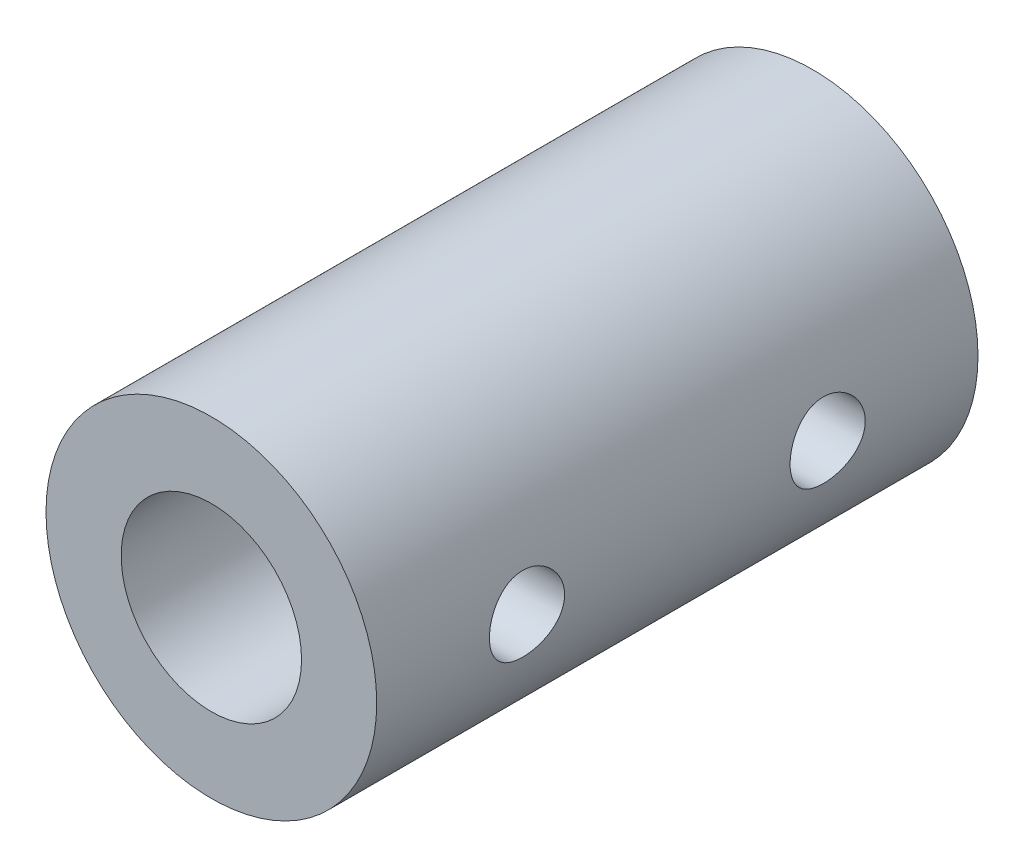
ISO-10303-21;
HEADER;
FILE_DESCRIPTION(('STEP AP214'),'2;1');
FILE_NAME('part.step','',(''),(''),'','','');
FILE_SCHEMA(('AUTOMOTIVE_DESIGN { 1 0 10303 214 1 1 1 1 }'));
ENDSEC;
DATA;
#1=APPLICATION_CONTEXT('core data for automotive mechanical design processes');
#2=APPLICATION_PROTOCOL_DEFINITION('international standard','automotive_design',2000,#1);
#3=PRODUCT_CONTEXT('',#1,'mechanical');
#4=PRODUCT('Part','Part','',(#3));
#5=PRODUCT_RELATED_PRODUCT_CATEGORY('part','',(#4));
#6=PRODUCT_DEFINITION_FORMATION('','',#4);
#7=PRODUCT_DEFINITION_CONTEXT('part definition',#1,'design');
#8=PRODUCT_DEFINITION('design','',#6,#7);
#9=PRODUCT_DEFINITION_SHAPE('','',#8);
#10=(LENGTH_UNIT() NAMED_UNIT(*) SI_UNIT(.MILLI.,.METRE.));
#11=(NAMED_UNIT(*) PLANE_ANGLE_UNIT() SI_UNIT($,.RADIAN.));
#12=(NAMED_UNIT(*) SI_UNIT($,.STERADIAN.) SOLID_ANGLE_UNIT());
#13=UNCERTAINTY_MEASURE_WITH_UNIT(LENGTH_MEASURE(1.E-05),#10,'distance_accuracy_value','');
#14=(GEOMETRIC_REPRESENTATION_CONTEXT(3) GLOBAL_UNCERTAINTY_ASSIGNED_CONTEXT((#13)) GLOBAL_UNIT_ASSIGNED_CONTEXT((#10,
#11,#12)) REPRESENTATION_CONTEXT('',''));
#15=CARTESIAN_POINT('',(0.,0.,0.));
#16=DIRECTION('',(0.,0.,1.));
#17=DIRECTION('',(1.,0.,0.));
#18=AXIS2_PLACEMENT_3D('',#15,#16,#17);
#19=CARTESIAN_POINT('',(0.,0.,20.));
#20=DIRECTION('',(0.,0.,1.));
#21=DIRECTION('',(1.,0.,0.));
#22=AXIS2_PLACEMENT_3D('',#19,#20,#21);
#23=PLANE('',#22);
#24=CARTESIAN_POINT('',(0.,0.,20.));
#25=DIRECTION('',(0.,0.,1.));
#26=DIRECTION('',(1.,0.,0.));
#27=AXIS2_PLACEMENT_3D('',#24,#25,#26);
#28=CIRCLE('',#27,5.5);
#29=CARTESIAN_POINT('',(5.5,0.,20.));
#30=VERTEX_POINT('',#29);
#31=EDGE_CURVE('E58',#30,#30,#28,.T.);
#32=ORIENTED_EDGE('',*,*,#31,.T.);
#33=EDGE_LOOP('',(#32));
#34=FACE_BOUND('',#33,.T.);
#35=CARTESIAN_POINT('',(0.,0.,20.));
#36=DIRECTION('',(0.,0.,1.));
#37=DIRECTION('',(1.,0.,0.));
#38=AXIS2_PLACEMENT_3D('',#35,#36,#37);
#39=CIRCLE('',#38,3.);
#40=CARTESIAN_POINT('',(3.,0.,20.));
#41=VERTEX_POINT('',#40);
#42=EDGE_CURVE('E94',#41,#41,#39,.T.);
#43=ORIENTED_EDGE('',*,*,#42,.F.);
#44=EDGE_LOOP('',(#43));
#45=FACE_BOUND('',#44,.T.);
#46=ADVANCED_FACE('F43',(#34,#45),#23,.T.);
#47=CARTESIAN_POINT('',(0.,0.,0.));
#48=DIRECTION('',(0.,0.,1.));
#49=DIRECTION('',(1.,0.,0.));
#50=AXIS2_PLACEMENT_3D('',#47,#48,#49);
#51=PLANE('',#50);
#52=CARTESIAN_POINT('',(0.,0.,0.));
#53=DIRECTION('',(0.,0.,1.));
#54=DIRECTION('',(1.,0.,0.));
#55=AXIS2_PLACEMENT_3D('',#52,#53,#54);
#56=CIRCLE('',#55,5.5);
#57=CARTESIAN_POINT('',(5.5,0.,0.));
#58=VERTEX_POINT('',#57);
#59=EDGE_CURVE('E63',#58,#58,#56,.T.);
#60=ORIENTED_EDGE('',*,*,#59,.F.);
#61=EDGE_LOOP('',(#60));
#62=FACE_BOUND('',#61,.T.);
#63=CARTESIAN_POINT('',(0.,0.,0.));
#64=DIRECTION('',(0.,0.,1.));
#65=DIRECTION('',(1.,0.,0.));
#66=AXIS2_PLACEMENT_3D('',#63,#64,#65);
#67=CIRCLE('',#66,3.);
#68=CARTESIAN_POINT('',(3.,0.,0.));
#69=VERTEX_POINT('',#68);
#70=EDGE_CURVE('E89',#69,#69,#67,.T.);
#71=ORIENTED_EDGE('',*,*,#70,.T.);
#72=EDGE_LOOP('',(#71));
#73=FACE_BOUND('',#72,.T.);
#74=ADVANCED_FACE('F102',(#62,#73),#51,.F.);
#75=CARTESIAN_POINT('',(0.,0.,20.));
#76=DIRECTION('',(0.,0.,-1.));
#77=DIRECTION('',(-1.,0.,0.));
#78=AXIS2_PLACEMENT_3D('',#75,#76,#77);
#79=CYLINDRICAL_SURFACE('',#78,5.5);
#80=CARTESIAN_POINT('',(5.5,0.,16.25));
#81=CARTESIAN_POINT('',(5.49999873675926,0.0692591392984521,16.2499977340868));
#82=CARTESIAN_POINT('',(5.49867854673065,0.138545086129004,16.2442243862115));
#83=CARTESIAN_POINT('',(5.493539660153,0.275144297299661,16.2213102619692));
#84=CARTESIAN_POINT('',(5.48971927481324,0.342456196110364,16.2041618020224));
#85=CARTESIAN_POINT('',(5.48000476561469,0.473113835992457,16.1590659756841));
#86=CARTESIAN_POINT('',(5.47411289428369,0.536463797478236,16.1311303360096));
#87=CARTESIAN_POINT('',(5.46088910081351,0.657576137912829,16.0652914433096));
#88=CARTESIAN_POINT('',(5.45355719301993,0.715338572515909,16.0273882895788));
#89=CARTESIAN_POINT('',(5.4381132908407,0.824633802223188,15.9419989776967));
#90=CARTESIAN_POINT('',(5.42999098791628,0.876056469460243,15.8943737132625));
#91=CARTESIAN_POINT('',(5.41395325591652,0.97025694908305,15.7911905129314));
#92=CARTESIAN_POINT('',(5.40603784654665,1.01303394060892,15.7356318246528));
#93=CARTESIAN_POINT('',(5.39120791846105,1.08922299700893,15.6173339723582));
#94=CARTESIAN_POINT('',(5.38430657902887,1.12251627178287,15.5545165018471));
#95=CARTESIAN_POINT('',(5.37243480737543,1.17803034858935,15.4239952497092));
#96=CARTESIAN_POINT('',(5.36746412440839,1.20025258858874,15.3562921039692));
#97=CARTESIAN_POINT('',(5.36012172349153,1.23262674706359,15.2191204064417));
#98=CARTESIAN_POINT('',(5.3577078986695,1.24297446340377,15.1497003684387));
#99=CARTESIAN_POINT('',(5.35562617033839,1.25191494225743,15.0100708863934));
#100=CARTESIAN_POINT('',(5.35595790132902,1.25050926943276,14.9398615486689));
#101=CARTESIAN_POINT('',(5.35929175179597,1.23614008479381,14.8021135583257));
#102=CARTESIAN_POINT('',(5.36224097064878,1.22340552299718,14.7345495469025));
#103=CARTESIAN_POINT('',(5.37039368363716,1.18710342460251,14.6025427569226));
#104=CARTESIAN_POINT('',(5.3755973132372,1.16353523702144,14.5381001661864));
#105=CARTESIAN_POINT('',(5.38772371922684,1.10602867201272,14.4135296640947));
#106=CARTESIAN_POINT('',(5.39466077989125,1.07200356043003,14.3534432411182));
#107=CARTESIAN_POINT('',(5.40946384216207,0.994609889602035,14.2397487234445));
#108=CARTESIAN_POINT('',(5.41732997981731,0.951239961185668,14.186141579868));
#109=CARTESIAN_POINT('',(5.43333076436253,0.85518259001758,14.0856107190895));
#110=CARTESIAN_POINT('',(5.44146738675749,0.802300833714135,14.0388727867418));
#111=CARTESIAN_POINT('',(5.45692512985791,0.68935614920486,13.9548970556464));
#112=CARTESIAN_POINT('',(5.46424623341466,0.629293070045399,13.9176594566503));
#113=CARTESIAN_POINT('',(5.47727487123187,0.503453995899576,13.8536898060143));
#114=CARTESIAN_POINT('',(5.48297842424367,0.437664417174078,13.8269836131888));
#115=CARTESIAN_POINT('',(5.49209994783491,0.302372561245848,13.785057997066));
#116=CARTESIAN_POINT('',(5.4955182778892,0.23287086983186,13.7698367670889));
#117=CARTESIAN_POINT('',(5.4996325035878,0.0937199200963662,13.7515868812637));
#118=CARTESIAN_POINT('',(5.50038500920564,0.0241055461685193,13.7483046543416));
#119=CARTESIAN_POINT('',(5.49924211275316,-0.114676943340051,13.7533365199265));
#120=CARTESIAN_POINT('',(5.49734690539558,-0.183845091360428,13.761649759703));
#121=CARTESIAN_POINT('',(5.49115740518707,-0.318920838609229,13.7894265834527));
#122=CARTESIAN_POINT('',(5.4868920435275,-0.384857518407212,13.8087557732219));
#123=CARTESIAN_POINT('',(5.47644030661836,-0.512551965438801,13.8578655137285));
#124=CARTESIAN_POINT('',(5.47025375902772,-0.574309357161442,13.8876470021266));
#125=CARTESIAN_POINT('',(5.45650716375474,-0.692930426280277,13.9573345717777));
#126=CARTESIAN_POINT('',(5.4489276492766,-0.749705342613595,13.9973878133866));
#127=CARTESIAN_POINT('',(5.43327304782299,-0.855818867895258,14.0862896642201));
#128=CARTESIAN_POINT('',(5.42519789109562,-0.905156426789845,14.1351395132734));
#129=CARTESIAN_POINT('',(5.40926438572433,-0.996008531090476,14.2414154825667));
#130=CARTESIAN_POINT('',(5.40141360596267,-1.03734683297031,14.2989936208934));
#131=CARTESIAN_POINT('',(5.3870011660802,-1.10976907203276,14.4204231953351));
#132=CARTESIAN_POINT('',(5.38043944897962,-1.14085346250508,14.4842743539798));
#133=CARTESIAN_POINT('',(5.36941374353368,-1.19166798620964,14.6160902347845));
#134=CARTESIAN_POINT('',(5.3649376890851,-1.21146358110852,14.6840286618717));
#135=CARTESIAN_POINT('',(5.35857055292907,-1.23932629170182,14.8223834533496));
#136=CARTESIAN_POINT('',(5.35667901955397,-1.24739545670807,14.8927993825682));
#137=CARTESIAN_POINT('',(5.35572514716112,-1.25148369607082,15.0323293096554));
#138=CARTESIAN_POINT('',(5.35659707290885,-1.24778274250535,15.1014347996668));
#139=CARTESIAN_POINT('',(5.36092234234569,-1.22906557701641,15.2380094550941));
#140=CARTESIAN_POINT('',(5.36437565044739,-1.21404952108504,15.3054786430552));
#141=CARTESIAN_POINT('',(5.37344130135242,-1.17326846180304,15.4366216986831));
#142=CARTESIAN_POINT('',(5.37904483343351,-1.14754728763997,15.5003098455707));
#143=CARTESIAN_POINT('',(5.39178236164052,-1.0861226830344,15.6225073534503));
#144=CARTESIAN_POINT('',(5.39891653159829,-1.05041811865611,15.6810161251628));
#145=CARTESIAN_POINT('',(5.41410553631702,-0.969124984455244,15.7925672138276));
#146=CARTESIAN_POINT('',(5.42217702793932,-0.923338228214169,15.8454628611037));
#147=CARTESIAN_POINT('',(5.43822274296525,-0.823578144662087,15.942911592541));
#148=CARTESIAN_POINT('',(5.44619694333323,-0.769602917703378,15.987462735483));
#149=CARTESIAN_POINT('',(5.46128466945207,-0.654070302575283,16.0675690301169));
#150=CARTESIAN_POINT('',(5.46838430808557,-0.5924158109381,16.1029869116666));
#151=CARTESIAN_POINT('',(5.48078202756997,-0.463877983855845,16.1628999853315));
#152=CARTESIAN_POINT('',(5.48608156233362,-0.396998922168847,16.1874039973933));
#153=CARTESIAN_POINT('',(5.49337797563919,-0.27508153576981,16.2206139530881));
#154=CARTESIAN_POINT('',(5.49584542792493,-0.220684055569244,16.2316119938446));
#155=CARTESIAN_POINT('',(5.49915690403688,-0.110863407465458,16.2463057367897));
#156=CARTESIAN_POINT('',(5.50000101119414,-0.0554402923585502,16.2500018138096));
#157=CARTESIAN_POINT('',(5.5,0.,16.25));
#158=B_SPLINE_CURVE_WITH_KNOTS('',3,(#80,#81,#82,#83,#84,#85,#86,#87,#88,#89,#90,#91,#92,#93,
#94,#95,#96,#97,#98,#99,#100,#101,#102,#103,#104,#105,#106,#107,#108,#109,#110,#111,#112,#113,
#114,#115,#116,#117,#118,#119,#120,#121,#122,#123,#124,#125,#126,#127,#128,#129,#130,#131,#132,
#133,#134,#135,#136,#137,#138,#139,#140,#141,#142,#143,#144,#145,#146,#147,#148,#149,#150,#151,
#152,#153,#154,#155,#156,#157),.UNSPECIFIED.,.T.,.F.,(4,2,2,2,2,2,2,2,2,2,2,2,2,2,2,2,2,2,2,2,2,
2,2,2,2,2,2,2,2,2,2,2,2,2,2,2,2,2,4),(0.,0.207574424816657,0.415289203498463,0.622778808776593,
0.830266347152624,1.04096194698404,1.25167754182901,1.46492681486707,1.67814838269119,
1.88780122449041,2.09742615684378,2.30290857087117,2.50840333376985,2.71565078719425,
2.92292862648988,3.13505765901851,3.3471911513493,3.55984232048323,3.77246003084947,
3.9805347095838,4.18859408731812,4.39416788074517,4.5997601206154,4.80848064664382,
5.01723061362836,5.23015660770196,5.44307318779737,5.65474220954493,5.86637423554698,
6.07301021975725,6.27964335529766,6.48543868288071,6.69125739465899,6.90155512892952,
7.11190172510031,7.32524638726731,7.53841832261075,7.70458523862177,7.87074362456999),.UNSPECIFIED.);
#159=CARTESIAN_POINT('',(5.5,0.,16.25));
#160=VERTEX_POINT('',#159);
#161=EDGE_CURVE('E90',#160,#160,#158,.T.);
#162=ORIENTED_EDGE('',*,*,#161,.T.);
#163=EDGE_LOOP('',(#162));
#164=FACE_BOUND('',#163,.T.);
#165=CARTESIAN_POINT('',(5.5,0.,6.25));
#166=CARTESIAN_POINT('',(5.49999873675926,0.0692591392984519,6.24999773408679));
#167=CARTESIAN_POINT('',(5.49867854673065,0.138545086129004,6.24422438621155));
#168=CARTESIAN_POINT('',(5.493539660153,0.275144297299661,6.22131026196915));
#169=CARTESIAN_POINT('',(5.48971927481324,0.342456196110364,6.20416180202237));
#170=CARTESIAN_POINT('',(5.48000476561469,0.473113835992457,6.15906597568405));
#171=CARTESIAN_POINT('',(5.4741128942837,0.536463797478235,6.13113033600963));
#172=CARTESIAN_POINT('',(5.46088910081351,0.657576137912828,6.06529144330956));
#173=CARTESIAN_POINT('',(5.45355719301993,0.715338572515908,6.02738828957879));
#174=CARTESIAN_POINT('',(5.4381132908407,0.824633802223187,5.94199897769666));
#175=CARTESIAN_POINT('',(5.42999098791629,0.876056469460242,5.8943737132625));
#176=CARTESIAN_POINT('',(5.41395325591652,0.970256949083049,5.79119051293138));
#177=CARTESIAN_POINT('',(5.40603784654665,1.01303394060892,5.73563182465277));
#178=CARTESIAN_POINT('',(5.39120791846105,1.08922299700893,5.61733397235816));
#179=CARTESIAN_POINT('',(5.38430657902887,1.12251627178287,5.55451650184708));
#180=CARTESIAN_POINT('',(5.37243480737543,1.17803034858935,5.42399524970919));
#181=CARTESIAN_POINT('',(5.36746412440839,1.20025258858874,5.35629210396919));
#182=CARTESIAN_POINT('',(5.36012172349153,1.23262674706359,5.21912040644173));
#183=CARTESIAN_POINT('',(5.3577078986695,1.24297446340377,5.14970036843873));
#184=CARTESIAN_POINT('',(5.35562617033839,1.25191494225743,5.01007088639345));
#185=CARTESIAN_POINT('',(5.35595790132901,1.25050926943276,4.93986154866886));
#186=CARTESIAN_POINT('',(5.35929175179597,1.23614008479381,4.80211355832565));
#187=CARTESIAN_POINT('',(5.36224097064878,1.22340552299719,4.73454954690255));
#188=CARTESIAN_POINT('',(5.37039368363716,1.18710342460251,4.60254275692259));
#189=CARTESIAN_POINT('',(5.3755973132372,1.16353523702144,4.53810016618641));
#190=CARTESIAN_POINT('',(5.38772371922684,1.10602867201272,4.41352966409474));
#191=CARTESIAN_POINT('',(5.39466077989125,1.07200356043004,4.35344324111816));
#192=CARTESIAN_POINT('',(5.40946384216207,0.994609889602037,4.23974872344447));
#193=CARTESIAN_POINT('',(5.41732997981731,0.951239961185669,4.18614157986804));
#194=CARTESIAN_POINT('',(5.43333076436253,0.855182590017581,4.08561071908949));
#195=CARTESIAN_POINT('',(5.44146738675749,0.802300833714136,4.03887278674183));
#196=CARTESIAN_POINT('',(5.45692512985791,0.689356149204861,3.95489705564645));
#197=CARTESIAN_POINT('',(5.46424623341466,0.6292930700454,3.91765945665027));
#198=CARTESIAN_POINT('',(5.47727487123187,0.503453995899577,3.85368980601425));
#199=CARTESIAN_POINT('',(5.48297842424367,0.437664417174079,3.82698361318884));
#200=CARTESIAN_POINT('',(5.49209994783491,0.302372561245849,3.78505799706604));
#201=CARTESIAN_POINT('',(5.4955182778892,0.23287086983186,3.76983676708891));
#202=CARTESIAN_POINT('',(5.4996325035878,0.0937199200963669,3.75158688126366));
#203=CARTESIAN_POINT('',(5.50038500920564,0.0241055461685197,3.74830465434164));
#204=CARTESIAN_POINT('',(5.49924211275316,-0.114676943340051,3.75333651992647));
#205=CARTESIAN_POINT('',(5.49734690539558,-0.183845091360428,3.76164975970299));
#206=CARTESIAN_POINT('',(5.49115740518707,-0.318920838609228,3.78942658345271));
#207=CARTESIAN_POINT('',(5.4868920435275,-0.384857518407211,3.80875577322187));
#208=CARTESIAN_POINT('',(5.47644030661836,-0.5125519654388,3.85786551372854));
#209=CARTESIAN_POINT('',(5.47025375902772,-0.574309357161442,3.88764700212663));
#210=CARTESIAN_POINT('',(5.45650716375474,-0.692930426280277,3.95733457177767));
#211=CARTESIAN_POINT('',(5.4489276492766,-0.749705342613595,3.99738781338658));
#212=CARTESIAN_POINT('',(5.43327304782299,-0.855818867895258,4.0862896642201));
#213=CARTESIAN_POINT('',(5.42519789109562,-0.905156426789845,4.13513951327342));
#214=CARTESIAN_POINT('',(5.40926438572433,-0.996008531090475,4.24141548256671));
#215=CARTESIAN_POINT('',(5.40141360596267,-1.03734683297031,4.29899362089341));
#216=CARTESIAN_POINT('',(5.3870011660802,-1.10976907203276,4.42042319533514));
#217=CARTESIAN_POINT('',(5.38043944897962,-1.14085346250508,4.48427435397981));
#218=CARTESIAN_POINT('',(5.36941374353368,-1.19166798620963,4.61609023478446));
#219=CARTESIAN_POINT('',(5.3649376890851,-1.21146358110852,4.68402866187168));
#220=CARTESIAN_POINT('',(5.35857055292907,-1.23932629170182,4.82238345334956));
#221=CARTESIAN_POINT('',(5.35667901955397,-1.24739545670807,4.8927993825682));
#222=CARTESIAN_POINT('',(5.35572514716112,-1.25148369607082,5.03232930965545));
#223=CARTESIAN_POINT('',(5.35659707290885,-1.24778274250535,5.1014347996668));
#224=CARTESIAN_POINT('',(5.36092234234569,-1.22906557701641,5.23800945509413));
#225=CARTESIAN_POINT('',(5.36437565044739,-1.21404952108504,5.30547864305523));
#226=CARTESIAN_POINT('',(5.37344130135242,-1.17326846180304,5.43662169868314));
#227=CARTESIAN_POINT('',(5.37904483343351,-1.14754728763997,5.50030984557075));
#228=CARTESIAN_POINT('',(5.39178236164052,-1.0861226830344,5.6225073534503));
#229=CARTESIAN_POINT('',(5.39891653159829,-1.05041811865611,5.68101612516275));
#230=CARTESIAN_POINT('',(5.41410553631702,-0.969124984455243,5.79256721382764));
#231=CARTESIAN_POINT('',(5.42217702793932,-0.923338228214167,5.84546286110369));
#232=CARTESIAN_POINT('',(5.43822274296525,-0.823578144662084,5.94291159254098));
#233=CARTESIAN_POINT('',(5.44619694333323,-0.769602917703375,5.98746273548298));
#234=CARTESIAN_POINT('',(5.46128466945207,-0.65407030257528,6.06756903011686));
#235=CARTESIAN_POINT('',(5.46838430808557,-0.592415810938097,6.10298691166657));
#236=CARTESIAN_POINT('',(5.48078202756997,-0.463877983855843,6.16289998533147));
#237=CARTESIAN_POINT('',(5.48608156233362,-0.396998922168846,6.18740399739333));
#238=CARTESIAN_POINT('',(5.49337797563919,-0.27508153576981,6.22061395308806));
#239=CARTESIAN_POINT('',(5.49584542792493,-0.220684055569243,6.23161199384465));
#240=CARTESIAN_POINT('',(5.49915690403688,-0.110863407465457,6.24630573678967));
#241=CARTESIAN_POINT('',(5.50000101119414,-0.05544029235855,6.25000181380958));
#242=CARTESIAN_POINT('',(5.5,0.,6.25));
#243=B_SPLINE_CURVE_WITH_KNOTS('',3,(#165,#166,#167,#168,#169,#170,#171,#172,#173,#174,#175,
#176,#177,#178,#179,#180,#181,#182,#183,#184,#185,#186,#187,#188,#189,#190,#191,#192,#193,#194,
#195,#196,#197,#198,#199,#200,#201,#202,#203,#204,#205,#206,#207,#208,#209,#210,#211,#212,#213,
#214,#215,#216,#217,#218,#219,#220,#221,#222,#223,#224,#225,#226,#227,#228,#229,#230,#231,#232,
#233,#234,#235,#236,#237,#238,#239,#240,#241,#242),.UNSPECIFIED.,.T.,.F.,(4,2,2,2,2,2,2,2,2,2,2,
2,2,2,2,2,2,2,2,2,2,2,2,2,2,2,2,2,2,2,2,2,2,2,2,2,2,2,4),(0.,0.207574424816657,
0.415289203498463,0.622778808776591,0.830266347152622,1.04096194698404,1.25167754182901,
1.46492681486707,1.67814838269119,1.8878012244904,2.09742615684378,2.30290857087117,
2.50840333376985,2.71565078719424,2.92292862648988,3.13505765901851,3.3471911513493,
3.55984232048323,3.77246003084946,3.9805347095838,4.18859408731812,4.39416788074517,
4.5997601206154,4.80848064664382,5.01723061362836,5.23015660770196,5.44307318779737,
5.65474220954493,5.86637423554697,6.07301021975725,6.27964335529766,6.48543868288071,
6.69125739465899,6.90155512892953,7.11190172510032,7.32524638726731,7.53841832261075,
7.70458523862177,7.87074362456999),.UNSPECIFIED.);
#244=CARTESIAN_POINT('',(5.5,0.,6.25));
#245=VERTEX_POINT('',#244);
#246=EDGE_CURVE('E10',#245,#245,#243,.T.);
#247=ORIENTED_EDGE('',*,*,#246,.T.);
#248=EDGE_LOOP('',(#247));
#249=FACE_BOUND('',#248,.T.);
#250=ORIENTED_EDGE('',*,*,#31,.F.);
#251=EDGE_LOOP('',(#250));
#252=FACE_BOUND('',#251,.T.);
#253=ORIENTED_EDGE('',*,*,#59,.T.);
#254=EDGE_LOOP('',(#253));
#255=FACE_BOUND('',#254,.T.);
#256=ADVANCED_FACE('F45',(#164,#249,#252,#255),#79,.T.);
#257=CARTESIAN_POINT('',(0.,0.,20.));
#258=DIRECTION('',(0.,0.,-1.));
#259=DIRECTION('',(-1.,0.,0.));
#260=AXIS2_PLACEMENT_3D('',#257,#258,#259);
#261=CYLINDRICAL_SURFACE('',#260,3.);
#262=CARTESIAN_POINT('',(3.,0.,16.25));
#263=CARTESIAN_POINT('',(2.99999458367273,0.0669580526362668,16.2499927949087));
#264=CARTESIAN_POINT('',(2.9977323297471,0.134021397063841,16.2445880414719));
#265=CARTESIAN_POINT('',(2.98890153579552,0.266247371156347,16.2231609350798));
#266=CARTESIAN_POINT('',(2.98232175901028,0.331404576423564,16.2071108755357));
#267=CARTESIAN_POINT('',(2.96556289038127,0.457688733653087,16.1650889082194));
#268=CARTESIAN_POINT('',(2.95539599975004,0.518828524426268,16.1391506105318));
#269=CARTESIAN_POINT('',(2.93245286470664,0.635829756679801,16.0782271767674));
#270=CARTESIAN_POINT('',(2.91967741092849,0.691692790015938,16.0432447810291));
#271=CARTESIAN_POINT('',(2.89207828351869,0.79944840355951,15.9633710174091));
#272=CARTESIAN_POINT('',(2.87718753326093,0.851041267517766,15.9180986912102));
#273=CARTESIAN_POINT('',(2.84732714068514,0.94615982109126,15.8197356652174));
#274=CARTESIAN_POINT('',(2.83235746106809,0.989681263153084,15.7666408751055));
#275=CARTESIAN_POINT('',(2.80321021812995,1.06953737697065,15.6509732224351));
#276=CARTESIAN_POINT('',(2.78910786873385,1.10541308153925,15.5880625515735));
#277=CARTESIAN_POINT('',(2.76435572357005,1.16593940588865,15.4564267420791));
#278=CARTESIAN_POINT('',(2.75370415000824,1.19059580836291,15.3877046205155));
#279=CARTESIAN_POINT('',(2.73778555387705,1.22674598312159,15.2498463082321));
#280=CARTESIAN_POINT('',(2.73228387651787,1.23881657877605,15.1808895166078));
#281=CARTESIAN_POINT('',(2.72661326219504,1.25125209967796,15.0417267073134));
#282=CARTESIAN_POINT('',(2.7264413842526,1.25162348054397,14.9715213999743));
#283=CARTESIAN_POINT('',(2.73125119560853,1.24108450363674,14.8375999395651));
#284=CARTESIAN_POINT('',(2.73583882723623,1.23103681112301,14.7737989034355));
#285=CARTESIAN_POINT('',(2.74898482773796,1.20139191015776,14.6488879089996));
#286=CARTESIAN_POINT('',(2.75754395703564,1.18179287287177,14.5877784685082));
#287=CARTESIAN_POINT('',(2.77786184772757,1.13321958727571,14.4684422970086));
#288=CARTESIAN_POINT('',(2.78968481949136,1.10405471539236,14.4103045790866));
#289=CARTESIAN_POINT('',(2.81518331141086,1.03731242580562,14.2995222661199));
#290=CARTESIAN_POINT('',(2.8288595612978,0.999731690519542,14.2468798493865));
#291=CARTESIAN_POINT('',(2.85792976877979,0.913495965543833,14.1439000412672));
#292=CARTESIAN_POINT('',(2.87337121404473,0.864173483207525,14.0941334326146));
#293=CARTESIAN_POINT('',(2.90325673112529,0.757729591051512,14.0033864970408));
#294=CARTESIAN_POINT('',(2.9177005687701,0.700606359448456,13.9624082283078));
#295=CARTESIAN_POINT('',(2.94438283556473,0.578447948693376,13.8895641763837));
#296=CARTESIAN_POINT('',(2.95656266543334,0.51326058244768,13.8579305548493));
#297=CARTESIAN_POINT('',(2.97689481414803,0.377852402526831,13.8062788603967));
#298=CARTESIAN_POINT('',(2.985049358458,0.307634394795034,13.7862543680562));
#299=CARTESIAN_POINT('',(2.99599641186385,0.168928113346227,13.7595840078734));
#300=CARTESIAN_POINT('',(2.99909541047125,0.100611285278639,13.7521721425563));
#301=CARTESIAN_POINT('',(3.00056050368745,-0.0363546554960887,13.7486537763859));
#302=CARTESIAN_POINT('',(2.99892795711939,-0.105003667152635,13.752544029748));
#303=CARTESIAN_POINT('',(2.9913121765694,-0.237098242341435,13.7709710848061));
#304=CARTESIAN_POINT('',(2.9855488728399,-0.300632966639386,13.7849699540972));
#305=CARTESIAN_POINT('',(2.97048606772414,-0.42438274897109,13.8224681945408));
#306=CARTESIAN_POINT('',(2.96118611959704,-0.48459738651836,13.8459687659503));
#307=CARTESIAN_POINT('',(2.93958270645166,-0.602108999869135,13.9025709757121));
#308=CARTESIAN_POINT('',(2.92719491469281,-0.659257236855323,13.935948183146));
#309=CARTESIAN_POINT('',(2.9007380457909,-0.767346216231428,14.0110533777917));
#310=CARTESIAN_POINT('',(2.88666826768733,-0.81828435260194,14.0527848515293));
#311=CARTESIAN_POINT('',(2.85712087895438,-0.916333430274262,14.1469032332724));
#312=CARTESIAN_POINT('',(2.84161451591029,-0.962910697979834,14.1998385029863));
#313=CARTESIAN_POINT('',(2.81184336768005,-1.04666984610551,14.3130212759354));
#314=CARTESIAN_POINT('',(2.79757886493439,-1.08384959285617,14.3732704351717));
#315=CARTESIAN_POINT('',(2.77181386243988,-1.14815960208699,14.5006141753026));
#316=CARTESIAN_POINT('',(2.76035562555112,-1.17513918237329,14.5677940355148));
#317=CARTESIAN_POINT('',(2.74208355658957,-1.21717413951573,14.7063705938101));
#318=CARTESIAN_POINT('',(2.73526589555752,-1.23223934863687,14.7777637624833));
#319=CARTESIAN_POINT('',(2.72763164537264,-1.249040803489,14.9168186991992));
#320=CARTESIAN_POINT('',(2.72639350967163,-1.25171380413129,14.9843446622926));
#321=CARTESIAN_POINT('',(2.72893853011024,-1.24615575523912,15.1188428611411));
#322=CARTESIAN_POINT('',(2.73272091540307,-1.23792637964721,15.1858151803137));
#323=CARTESIAN_POINT('',(2.74449551302268,-1.21158404780491,15.3140927474689));
#324=CARTESIAN_POINT('',(2.7522835484648,-1.19394903571466,15.3755166734634));
#325=CARTESIAN_POINT('',(2.77103181199189,-1.14976328202134,15.4945480213572));
#326=CARTESIAN_POINT('',(2.78199293131693,-1.12321003517252,15.5521543653988));
#327=CARTESIAN_POINT('',(2.80666954560013,-1.06010285935489,15.6656958959491));
#328=CARTESIAN_POINT('',(2.82051102713679,-1.02304360910483,15.7213223301683));
#329=CARTESIAN_POINT('',(2.84903689053839,-0.94068407263039,15.8258601393607));
#330=CARTESIAN_POINT('',(2.86372156345875,-0.895380928905618,15.8747691756006));
#331=CARTESIAN_POINT('',(2.89356392850106,-0.793902045778819,15.9681486816847));
#332=CARTESIAN_POINT('',(2.90867817511792,-0.737174739949026,16.0120364328406));
#333=CARTESIAN_POINT('',(2.9366014362202,-0.616600079253197,16.0896994535436));
#334=CARTESIAN_POINT('',(2.9494093991674,-0.552749497945744,16.1234701148895));
#335=CARTESIAN_POINT('',(2.97109183362461,-0.42073205671795,16.1792098454399));
#336=CARTESIAN_POINT('',(2.98002782581964,-0.352653990980635,16.2013647666173));
#337=CARTESIAN_POINT('',(2.99321009768625,-0.213410421846558,16.2337063290778));
#338=CARTESIAN_POINT('',(2.99747105811967,-0.142255316980956,16.2439304425299));
#339=CARTESIAN_POINT('',(2.99972287568934,-0.047236081919182,16.2493331610864));
#340=CARTESIAN_POINT('',(3.00000191102536,-0.0236245946756565,16.2500025421492));
#341=CARTESIAN_POINT('',(3.,0.,16.25));
#342=B_SPLINE_CURVE_WITH_KNOTS('',3,(#262,#263,#264,#265,#266,#267,#268,#269,#270,#271,#272,
#273,#274,#275,#276,#277,#278,#279,#280,#281,#282,#283,#284,#285,#286,#287,#288,#289,#290,#291,
#292,#293,#294,#295,#296,#297,#298,#299,#300,#301,#302,#303,#304,#305,#306,#307,#308,#309,#310,
#311,#312,#313,#314,#315,#316,#317,#318,#319,#320,#321,#322,#323,#324,#325,#326,#327,#328,#329,
#330,#331,#332,#333,#334,#335,#336,#337,#338,#339,#340,#341),.UNSPECIFIED.,.T.,.F.,(4,2,2,2,2,2,
2,2,2,2,2,2,2,2,2,2,2,2,2,2,2,2,2,2,2,2,2,2,2,2,2,2,2,2,2,2,2,2,2,4),(0.,0.200806918883939,
0.402138540628696,0.602791851906301,0.803384436852972,1.01317936288807,1.22308438131465,
1.44331724539125,1.66343646730588,1.87295273137557,2.08235338249046,2.27570157202556,
2.46908679727212,2.66658713058714,2.86416545717206,3.07844141127896,3.29276749314587,
3.51204055060813,3.73119224218296,3.9364844339325,4.14171767493171,4.33676589735721,
4.53183876601784,4.7329713527216,4.93418805469495,5.14978488029293,5.3654306124034,
5.58414788359523,5.8026844707458,6.00439877559643,6.20608211297535,6.39837649964761,
6.59072494950611,6.7946389339744,6.99862373425943,7.21746535004888,7.43640649428581,
7.65172855819384,7.8663725046932,7.93722256499097),.UNSPECIFIED.);
#343=CARTESIAN_POINT('',(3.,0.,16.25));
#344=VERTEX_POINT('',#343);
#345=EDGE_CURVE('E48',#344,#344,#342,.T.);
#346=ORIENTED_EDGE('',*,*,#345,.F.);
#347=EDGE_LOOP('',(#346));
#348=FACE_BOUND('',#347,.T.);
#349=CARTESIAN_POINT('',(3.,0.,6.25));
#350=CARTESIAN_POINT('',(2.99999458367273,0.0669580526362667,6.2499927949087));
#351=CARTESIAN_POINT('',(2.9977323297471,0.134021397063841,6.24458804147186));
#352=CARTESIAN_POINT('',(2.98890153579552,0.266247371156347,6.22316093507982));
#353=CARTESIAN_POINT('',(2.98232175901028,0.331404576423564,6.20711087553575));
#354=CARTESIAN_POINT('',(2.96556289038127,0.457688733653087,6.16508890821941));
#355=CARTESIAN_POINT('',(2.95539599975004,0.518828524426268,6.13915061053185));
#356=CARTESIAN_POINT('',(2.93245286470664,0.635829756679801,6.07822717676743));
#357=CARTESIAN_POINT('',(2.91967741092849,0.691692790015938,6.04324478102913));
#358=CARTESIAN_POINT('',(2.89207828351869,0.799448403559511,5.96337101740912));
#359=CARTESIAN_POINT('',(2.87718753326093,0.851041267517767,5.91809869121025));
#360=CARTESIAN_POINT('',(2.84732714068514,0.946159821091261,5.81973566521743));
#361=CARTESIAN_POINT('',(2.83235746106809,0.989681263153084,5.76664087510549));
#362=CARTESIAN_POINT('',(2.80321021812995,1.06953737697065,5.65097322243511));
#363=CARTESIAN_POINT('',(2.78910786873385,1.10541308153925,5.58806255157346));
#364=CARTESIAN_POINT('',(2.76435572357005,1.16593940588866,5.45642674207907));
#365=CARTESIAN_POINT('',(2.75370415000824,1.19059580836291,5.38770462051555));
#366=CARTESIAN_POINT('',(2.73778555387705,1.22674598312159,5.24984630823208));
#367=CARTESIAN_POINT('',(2.73228387651787,1.23881657877605,5.18088951660785));
#368=CARTESIAN_POINT('',(2.72661326219504,1.25125209967796,5.04172670731343));
#369=CARTESIAN_POINT('',(2.7264413842526,1.25162348054397,4.97152139997426));
#370=CARTESIAN_POINT('',(2.73125119560853,1.24108450363674,4.83759993956506));
#371=CARTESIAN_POINT('',(2.73583882723623,1.23103681112301,4.77379890343554));
#372=CARTESIAN_POINT('',(2.74898482773796,1.20139191015776,4.64888790899961));
#373=CARTESIAN_POINT('',(2.75754395703564,1.18179287287177,4.58777846850823));
#374=CARTESIAN_POINT('',(2.77786184772757,1.13321958727571,4.46844229700856));
#375=CARTESIAN_POINT('',(2.78968481949136,1.10405471539236,4.41030457908662));
#376=CARTESIAN_POINT('',(2.81518331141086,1.03731242580562,4.29952226611986));
#377=CARTESIAN_POINT('',(2.82885956129779,0.999731690519543,4.24687984938649));
#378=CARTESIAN_POINT('',(2.85792976877979,0.913495965543834,4.14390004126716));
#379=CARTESIAN_POINT('',(2.87337121404473,0.864173483207526,4.09413343261457));
#380=CARTESIAN_POINT('',(2.90325673112529,0.757729591051511,4.00338649704082));
#381=CARTESIAN_POINT('',(2.9177005687701,0.700606359448456,3.96240822830782));
#382=CARTESIAN_POINT('',(2.94438283556473,0.578447948693376,3.88956417638374));
#383=CARTESIAN_POINT('',(2.95656266543334,0.51326058244768,3.85793055484932));
#384=CARTESIAN_POINT('',(2.97689481414803,0.377852402526832,3.80627886039674));
#385=CARTESIAN_POINT('',(2.985049358458,0.307634394795035,3.78625436805619));
#386=CARTESIAN_POINT('',(2.99599641186385,0.168928113346229,3.75958400787337));
#387=CARTESIAN_POINT('',(2.99909541047125,0.10061128527864,3.75217214255625));
#388=CARTESIAN_POINT('',(3.00056050368745,-0.0363546554960883,3.74865377638591));
#389=CARTESIAN_POINT('',(2.99892795711939,-0.105003667152635,3.752544029748));
#390=CARTESIAN_POINT('',(2.9913121765694,-0.237098242341434,3.77097108480607));
#391=CARTESIAN_POINT('',(2.9855488728399,-0.300632966639386,3.7849699540972));
#392=CARTESIAN_POINT('',(2.97048606772414,-0.42438274897109,3.82246819454079));
#393=CARTESIAN_POINT('',(2.96118611959704,-0.48459738651836,3.84596876595031));
#394=CARTESIAN_POINT('',(2.93958270645166,-0.602108999869135,3.90257097571212));
#395=CARTESIAN_POINT('',(2.92719491469281,-0.659257236855322,3.93594818314604));
#396=CARTESIAN_POINT('',(2.9007380457909,-0.767346216231427,4.0110533777917));
#397=CARTESIAN_POINT('',(2.88666826768733,-0.818284352601939,4.05278485152928));
#398=CARTESIAN_POINT('',(2.85712087895438,-0.916333430274263,4.14690323327241));
#399=CARTESIAN_POINT('',(2.84161451591029,-0.962910697979834,4.19983850298626));
#400=CARTESIAN_POINT('',(2.81184336768005,-1.04666984610551,4.31302127593539));
#401=CARTESIAN_POINT('',(2.79757886493439,-1.08384959285617,4.37327043517174));
#402=CARTESIAN_POINT('',(2.77181386243988,-1.14815960208699,4.50061417530258));
#403=CARTESIAN_POINT('',(2.76035562555112,-1.17513918237329,4.56779403551483));
#404=CARTESIAN_POINT('',(2.74208355658957,-1.21717413951573,4.70637059381011));
#405=CARTESIAN_POINT('',(2.73526589555752,-1.23223934863687,4.77776376248335));
#406=CARTESIAN_POINT('',(2.72763164537264,-1.249040803489,4.91681869919921));
#407=CARTESIAN_POINT('',(2.72639350967163,-1.25171380413129,4.98434466229262));
#408=CARTESIAN_POINT('',(2.72893853011024,-1.24615575523912,5.1188428611411));
#409=CARTESIAN_POINT('',(2.73272091540307,-1.23792637964721,5.1858151803137));
#410=CARTESIAN_POINT('',(2.74449551302268,-1.21158404780491,5.31409274746889));
#411=CARTESIAN_POINT('',(2.7522835484648,-1.19394903571466,5.37551667346339));
#412=CARTESIAN_POINT('',(2.77103181199189,-1.14976328202134,5.49454802135723));
#413=CARTESIAN_POINT('',(2.78199293131693,-1.12321003517252,5.55215436539878));
#414=CARTESIAN_POINT('',(2.80666954560013,-1.06010285935489,5.66569589594912));
#415=CARTESIAN_POINT('',(2.82051102713679,-1.02304360910483,5.72132233016829));
#416=CARTESIAN_POINT('',(2.84903689053839,-0.940684072630389,5.82586013936068));
#417=CARTESIAN_POINT('',(2.86372156345875,-0.895380928905617,5.87476917560057));
#418=CARTESIAN_POINT('',(2.89356392850106,-0.793902045778819,5.96814868168474));
#419=CARTESIAN_POINT('',(2.90867817511792,-0.737174739949026,6.01203643284065));
#420=CARTESIAN_POINT('',(2.9366014362202,-0.616600079253198,6.08969945354362));
#421=CARTESIAN_POINT('',(2.9494093991674,-0.552749497945744,6.12347011488955));
#422=CARTESIAN_POINT('',(2.97109183362461,-0.420732056717949,6.17920984543988));
#423=CARTESIAN_POINT('',(2.98002782581964,-0.352653990980635,6.2013647666173));
#424=CARTESIAN_POINT('',(2.99321009768625,-0.213410421846558,6.23370632907783));
#425=CARTESIAN_POINT('',(2.99747105811967,-0.142255316980957,6.24393044252988));
#426=CARTESIAN_POINT('',(2.99972287568934,-0.0472360819191831,6.24933316108645));
#427=CARTESIAN_POINT('',(3.00000191102536,-0.023624594675657,6.25000254214922));
#428=CARTESIAN_POINT('',(3.,0.,6.25));
#429=B_SPLINE_CURVE_WITH_KNOTS('',3,(#349,#350,#351,#352,#353,#354,#355,#356,#357,#358,#359,
#360,#361,#362,#363,#364,#365,#366,#367,#368,#369,#370,#371,#372,#373,#374,#375,#376,#377,#378,
#379,#380,#381,#382,#383,#384,#385,#386,#387,#388,#389,#390,#391,#392,#393,#394,#395,#396,#397,
#398,#399,#400,#401,#402,#403,#404,#405,#406,#407,#408,#409,#410,#411,#412,#413,#414,#415,#416,
#417,#418,#419,#420,#421,#422,#423,#424,#425,#426,#427,#428),.UNSPECIFIED.,.T.,.F.,(4,2,2,2,2,2,
2,2,2,2,2,2,2,2,2,2,2,2,2,2,2,2,2,2,2,2,2,2,2,2,2,2,2,2,2,2,2,2,2,4),(0.,0.200806918883938,
0.402138540628696,0.602791851906301,0.803384436852973,1.01317936288807,1.22308438131465,
1.44331724539125,1.66343646730588,1.87295273137557,2.08235338249046,2.27570157202556,
2.46908679727212,2.66658713058714,2.86416545717206,3.07844141127896,3.29276749314587,
3.51204055060813,3.73119224218296,3.9364844339325,4.14171767493171,4.33676589735721,
4.53183876601784,4.7329713527216,4.93418805469495,5.14978488029293,5.36543061240341,
5.58414788359523,5.8026844707458,6.00439877559643,6.20608211297535,6.39837649964762,
6.59072494950612,6.7946389339744,6.99862373425943,7.21746535004888,7.43640649428581,
7.65172855819384,7.8663725046932,7.93722256499097),.UNSPECIFIED.);
#430=CARTESIAN_POINT('',(3.,0.,6.25));
#431=VERTEX_POINT('',#430);
#432=EDGE_CURVE('E81',#431,#431,#429,.T.);
#433=ORIENTED_EDGE('',*,*,#432,.F.);
#434=EDGE_LOOP('',(#433));
#435=FACE_BOUND('',#434,.T.);
#436=ORIENTED_EDGE('',*,*,#42,.T.);
#437=EDGE_LOOP('',(#436));
#438=FACE_BOUND('',#437,.T.);
#439=ORIENTED_EDGE('',*,*,#70,.F.);
#440=EDGE_LOOP('',(#439));
#441=FACE_BOUND('',#440,.T.);
#442=ADVANCED_FACE('F74',(#348,#435,#438,#441),#261,.F.);
#443=CARTESIAN_POINT('',(0.,0.,5.));
#444=DIRECTION('',(-1.,0.,0.));
#445=DIRECTION('',(0.,0.,1.));
#446=AXIS2_PLACEMENT_3D('',#443,#444,#445);
#447=CYLINDRICAL_SURFACE('',#446,1.25);
#448=ORIENTED_EDGE('',*,*,#432,.T.);
#449=EDGE_LOOP('',(#448));
#450=FACE_BOUND('',#449,.T.);
#451=ORIENTED_EDGE('',*,*,#246,.F.);
#452=EDGE_LOOP('',(#451));
#453=FACE_BOUND('',#452,.T.);
#454=ADVANCED_FACE('F70',(#450,#453),#447,.F.);
#455=CARTESIAN_POINT('',(0.,0.,15.));
#456=DIRECTION('',(-1.,0.,0.));
#457=DIRECTION('',(0.,0.,1.));
#458=AXIS2_PLACEMENT_3D('',#455,#456,#457);
#459=CYLINDRICAL_SURFACE('',#458,1.25);
#460=ORIENTED_EDGE('',*,*,#345,.T.);
#461=EDGE_LOOP('',(#460));
#462=FACE_BOUND('',#461,.T.);
#463=ORIENTED_EDGE('',*,*,#161,.F.);
#464=EDGE_LOOP('',(#463));
#465=FACE_BOUND('',#464,.T.);
#466=ADVANCED_FACE('F73',(#462,#465),#459,.F.);
#467=CLOSED_SHELL('',(#46,#74,#256,#442,#454,#466));
#468=MANIFOLD_SOLID_BREP('B2',#467);
#469=ADVANCED_BREP_SHAPE_REPRESENTATION('',(#18,#468),#14);
#470=SHAPE_DEFINITION_REPRESENTATION(#9,#469);
ENDSEC;
END-ISO-10303-21;
